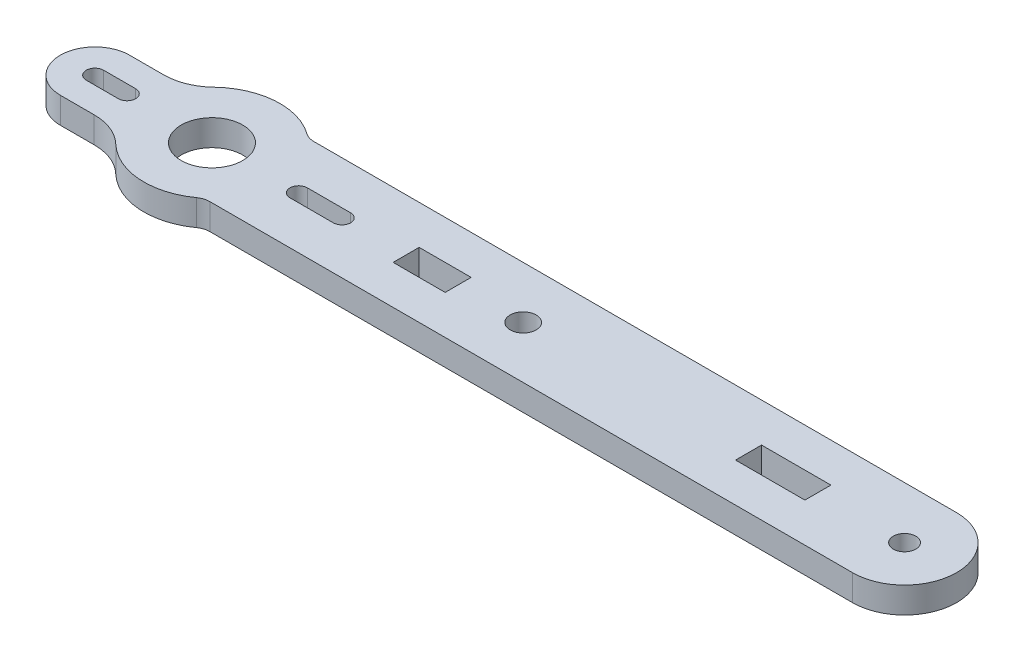
ISO-10303-21;
HEADER;
FILE_DESCRIPTION(('STEP AP214'),'2;1');
FILE_NAME('part.step','',(''),(''),'','','');
FILE_SCHEMA(('AUTOMOTIVE_DESIGN { 1 0 10303 214 1 1 1 1 }'));
ENDSEC;
DATA;
#1=APPLICATION_CONTEXT('core data for automotive mechanical design processes');
#2=APPLICATION_PROTOCOL_DEFINITION('international standard','automotive_design',2000,#1);
#3=PRODUCT_CONTEXT('',#1,'mechanical');
#4=PRODUCT('Part','Part','',(#3));
#5=PRODUCT_RELATED_PRODUCT_CATEGORY('part','',(#4));
#6=PRODUCT_DEFINITION_FORMATION('','',#4);
#7=PRODUCT_DEFINITION_CONTEXT('part definition',#1,'design');
#8=PRODUCT_DEFINITION('design','',#6,#7);
#9=PRODUCT_DEFINITION_SHAPE('','',#8);
#10=(LENGTH_UNIT() NAMED_UNIT(*) SI_UNIT(.MILLI.,.METRE.));
#11=(NAMED_UNIT(*) PLANE_ANGLE_UNIT() SI_UNIT($,.RADIAN.));
#12=(NAMED_UNIT(*) SI_UNIT($,.STERADIAN.) SOLID_ANGLE_UNIT());
#13=UNCERTAINTY_MEASURE_WITH_UNIT(LENGTH_MEASURE(1.E-05),#10,'distance_accuracy_value','');
#14=(GEOMETRIC_REPRESENTATION_CONTEXT(3) GLOBAL_UNCERTAINTY_ASSIGNED_CONTEXT((#13)) GLOBAL_UNIT_ASSIGNED_CONTEXT((#10,
#11,#12)) REPRESENTATION_CONTEXT('',''));
#15=CARTESIAN_POINT('',(0.,0.,0.));
#16=DIRECTION('',(0.,0.,1.));
#17=DIRECTION('',(1.,0.,0.));
#18=AXIS2_PLACEMENT_3D('',#15,#16,#17);
#19=CARTESIAN_POINT('',(0.,-3.,0.));
#20=DIRECTION('',(0.,1.,0.));
#21=DIRECTION('',(0.,0.,1.));
#22=AXIS2_PLACEMENT_3D('',#19,#20,#21);
#23=CYLINDRICAL_SURFACE('',#22,4.);
#24=CARTESIAN_POINT('',(0.,0.,0.));
#25=DIRECTION('',(0.,1.,0.));
#26=DIRECTION('',(0.,0.,1.));
#27=AXIS2_PLACEMENT_3D('',#24,#25,#26);
#28=CIRCLE('',#27,4.);
#29=CARTESIAN_POINT('',(0.,0.,-4.));
#30=VERTEX_POINT('',#29);
#31=CARTESIAN_POINT('',(0.,0.,4.));
#32=VERTEX_POINT('',#31);
#33=EDGE_CURVE('E369',#30,#32,#28,.T.);
#34=ORIENTED_EDGE('',*,*,#33,.F.);
#35=DIRECTION('',(0.,1.,0.));
#36=VECTOR('',#35,1.);
#37=CARTESIAN_POINT('',(0.,-3.,-4.));
#38=LINE('',#37,#36);
#39=CARTESIAN_POINT('',(0.,-3.,-4.));
#40=VERTEX_POINT('',#39);
#41=EDGE_CURVE('E410',#40,#30,#38,.T.);
#42=ORIENTED_EDGE('',*,*,#41,.F.);
#43=CARTESIAN_POINT('',(0.,-3.,0.));
#44=DIRECTION('',(0.,1.,0.));
#45=DIRECTION('',(0.,0.,1.));
#46=AXIS2_PLACEMENT_3D('',#43,#44,#45);
#47=CIRCLE('',#46,4.);
#48=CARTESIAN_POINT('',(0.,-3.,4.));
#49=VERTEX_POINT('',#48);
#50=EDGE_CURVE('E370',#40,#49,#47,.T.);
#51=ORIENTED_EDGE('',*,*,#50,.T.);
#52=DIRECTION('',(0.,1.,0.));
#53=VECTOR('',#52,1.);
#54=CARTESIAN_POINT('',(0.,-3.,4.));
#55=LINE('',#54,#53);
#56=EDGE_CURVE('E391',#49,#32,#55,.T.);
#57=ORIENTED_EDGE('',*,*,#56,.T.);
#58=EDGE_LOOP('',(#34,#42,#51,#57));
#59=FACE_BOUND('',#58,.T.);
#60=ADVANCED_FACE('F36',(#59),#23,.T.);
#61=CARTESIAN_POINT('',(0.,-3.,-4.));
#62=DIRECTION('',(0.,0.,1.));
#63=DIRECTION('',(1.,0.,0.));
#64=AXIS2_PLACEMENT_3D('',#61,#62,#63);
#65=PLANE('',#64);
#66=DIRECTION('',(1.,0.,0.));
#67=VECTOR('',#66,1.);
#68=CARTESIAN_POINT('',(0.,0.,-4.));
#69=LINE('',#68,#67);
#70=CARTESIAN_POINT('',(3.91759424778935,0.,-4.));
#71=VERTEX_POINT('',#70);
#72=EDGE_CURVE('E374',#30,#71,#69,.T.);
#73=ORIENTED_EDGE('',*,*,#72,.T.);
#74=DIRECTION('',(0.,1.,0.));
#75=VECTOR('',#74,1.);
#76=CARTESIAN_POINT('',(3.91759424778935,-3.,-4.));
#77=LINE('',#76,#75);
#78=CARTESIAN_POINT('',(3.91759424778935,-3.,-4.));
#79=VERTEX_POINT('',#78);
#80=EDGE_CURVE('E51',#71,#79,#77,.F.);
#81=ORIENTED_EDGE('',*,*,#80,.T.);
#82=DIRECTION('',(1.,0.,0.));
#83=VECTOR('',#82,1.);
#84=CARTESIAN_POINT('',(0.,-3.,-4.));
#85=LINE('',#84,#83);
#86=EDGE_CURVE('E389',#40,#79,#85,.T.);
#87=ORIENTED_EDGE('',*,*,#86,.F.);
#88=ORIENTED_EDGE('',*,*,#41,.T.);
#89=EDGE_LOOP('',(#73,#81,#87,#88));
#90=FACE_BOUND('',#89,.T.);
#91=ADVANCED_FACE('F500',(#90),#65,.F.);
#92=CARTESIAN_POINT('',(13.5,-3.,0.));
#93=DIRECTION('',(0.,1.,0.));
#94=DIRECTION('',(0.,0.,1.));
#95=AXIS2_PLACEMENT_3D('',#92,#93,#94);
#96=CYLINDRICAL_SURFACE('',#95,7.84999999999999);
#97=CARTESIAN_POINT('',(13.5,-3.,0.));
#98=DIRECTION('',(0.,1.,0.));
#99=DIRECTION('',(0.,0.,1.));
#100=AXIS2_PLACEMENT_3D('',#97,#98,#99);
#101=CIRCLE('',#100,7.84999999999999);
#102=CARTESIAN_POINT('',(18.0797144557127,-3.,-6.3756345177665));
#103=VERTEX_POINT('',#102);
#104=CARTESIAN_POINT('',(8.06881695632826,-3.,-5.66787003610108));
#105=VERTEX_POINT('',#104);
#106=EDGE_CURVE('E380',#103,#105,#101,.T.);
#107=ORIENTED_EDGE('',*,*,#106,.T.);
#108=DIRECTION('',(0.,1.,0.));
#109=VECTOR('',#108,1.);
#110=CARTESIAN_POINT('',(8.06881695632826,-3.,-5.66787003610108));
#111=LINE('',#110,#109);
#112=CARTESIAN_POINT('',(8.06881695632826,0.,-5.66787003610108));
#113=VERTEX_POINT('',#112);
#114=EDGE_CURVE('E441',#105,#113,#111,.T.);
#115=ORIENTED_EDGE('',*,*,#114,.T.);
#116=CARTESIAN_POINT('',(13.5,0.,0.));
#117=DIRECTION('',(0.,1.,0.));
#118=DIRECTION('',(0.,0.,1.));
#119=AXIS2_PLACEMENT_3D('',#116,#117,#118);
#120=CIRCLE('',#119,7.84999999999999);
#121=CARTESIAN_POINT('',(18.0797144557127,0.,-6.3756345177665));
#122=VERTEX_POINT('',#121);
#123=EDGE_CURVE('E400',#122,#113,#120,.T.);
#124=ORIENTED_EDGE('',*,*,#123,.F.);
#125=DIRECTION('',(0.,1.,0.));
#126=VECTOR('',#125,1.);
#127=CARTESIAN_POINT('',(18.0797144557127,-3.,-6.3756345177665));
#128=LINE('',#127,#126);
#129=EDGE_CURVE('E425',#122,#103,#128,.F.);
#130=ORIENTED_EDGE('',*,*,#129,.T.);
#131=EDGE_LOOP('',(#107,#115,#124,#130));
#132=FACE_BOUND('',#131,.T.);
#133=ADVANCED_FACE('F491',(#132),#96,.T.);
#134=CARTESIAN_POINT('',(0.,-3.,-6.00000000000001));
#135=DIRECTION('',(0.,0.,-1.));
#136=DIRECTION('',(-1.,0.,0.));
#137=AXIS2_PLACEMENT_3D('',#134,#135,#136);
#138=PLANE('',#137);
#139=DIRECTION('',(-1.,0.,0.));
#140=VECTOR('',#139,1.);
#141=CARTESIAN_POINT('',(0.,-3.,-6.00000000000001));
#142=LINE('',#141,#140);
#143=CARTESIAN_POINT('',(93.4,-3.,-6.));
#144=VERTEX_POINT('',#143);
#145=CARTESIAN_POINT('',(19.2465206864676,-3.,-6.00000000000001));
#146=VERTEX_POINT('',#145);
#147=EDGE_CURVE('E386',#144,#146,#142,.T.);
#148=ORIENTED_EDGE('',*,*,#147,.T.);
#149=DIRECTION('',(0.,-1.,0.));
#150=VECTOR('',#149,1.);
#151=CARTESIAN_POINT('',(19.2465206864676,0.,-6.00000000000001));
#152=LINE('',#151,#150);
#153=CARTESIAN_POINT('',(19.2465206864676,0.,-6.00000000000001));
#154=VERTEX_POINT('',#153);
#155=EDGE_CURVE('E422',#146,#154,#152,.F.);
#156=ORIENTED_EDGE('',*,*,#155,.T.);
#157=DIRECTION('',(-1.,0.,0.));
#158=VECTOR('',#157,1.);
#159=CARTESIAN_POINT('',(0.,0.,-6.00000000000001));
#160=LINE('',#159,#158);
#161=CARTESIAN_POINT('',(93.4,0.,-6.));
#162=VERTEX_POINT('',#161);
#163=EDGE_CURVE('E406',#162,#154,#160,.T.);
#164=ORIENTED_EDGE('',*,*,#163,.F.);
#165=DIRECTION('',(0.,1.,0.));
#166=VECTOR('',#165,1.);
#167=CARTESIAN_POINT('',(93.4,-3.,-6.));
#168=LINE('',#167,#166);
#169=EDGE_CURVE('E413',#144,#162,#168,.T.);
#170=ORIENTED_EDGE('',*,*,#169,.F.);
#171=EDGE_LOOP('',(#148,#156,#164,#170));
#172=FACE_BOUND('',#171,.T.);
#173=ADVANCED_FACE('F481',(#172),#138,.T.);
#174=CARTESIAN_POINT('',(93.4,-3.,0.));
#175=DIRECTION('',(0.,1.,0.));
#176=DIRECTION('',(0.,0.,1.));
#177=AXIS2_PLACEMENT_3D('',#174,#175,#176);
#178=CYLINDRICAL_SURFACE('',#177,6.);
#179=CARTESIAN_POINT('',(93.4,0.,0.));
#180=DIRECTION('',(0.,1.,0.));
#181=DIRECTION('',(0.,0.,1.));
#182=AXIS2_PLACEMENT_3D('',#179,#180,#181);
#183=CIRCLE('',#182,6.);
#184=CARTESIAN_POINT('',(93.4,0.,6.));
#185=VERTEX_POINT('',#184);
#186=EDGE_CURVE('E403',#185,#162,#183,.T.);
#187=ORIENTED_EDGE('',*,*,#186,.F.);
#188=DIRECTION('',(0.,1.,0.));
#189=VECTOR('',#188,1.);
#190=CARTESIAN_POINT('',(93.4,-3.,6.));
#191=LINE('',#190,#189);
#192=CARTESIAN_POINT('',(93.4,-3.,6.));
#193=VERTEX_POINT('',#192);
#194=EDGE_CURVE('E415',#193,#185,#191,.T.);
#195=ORIENTED_EDGE('',*,*,#194,.F.);
#196=CARTESIAN_POINT('',(93.4,-3.,0.));
#197=DIRECTION('',(0.,1.,0.));
#198=DIRECTION('',(0.,0.,1.));
#199=AXIS2_PLACEMENT_3D('',#196,#197,#198);
#200=CIRCLE('',#199,6.);
#201=EDGE_CURVE('E383',#193,#144,#200,.T.);
#202=ORIENTED_EDGE('',*,*,#201,.T.);
#203=ORIENTED_EDGE('',*,*,#169,.T.);
#204=EDGE_LOOP('',(#187,#195,#202,#203));
#205=FACE_BOUND('',#204,.T.);
#206=ADVANCED_FACE('F477',(#205),#178,.T.);
#207=CARTESIAN_POINT('',(0.,-3.,6.00000000000001));
#208=DIRECTION('',(0.,0.,-1.));
#209=DIRECTION('',(-1.,0.,0.));
#210=AXIS2_PLACEMENT_3D('',#207,#208,#209);
#211=PLANE('',#210);
#212=DIRECTION('',(-1.,0.,0.));
#213=VECTOR('',#212,1.);
#214=CARTESIAN_POINT('',(0.,0.,6.00000000000001));
#215=LINE('',#214,#213);
#216=CARTESIAN_POINT('',(19.2465206864676,0.,6.00000000000001));
#217=VERTEX_POINT('',#216);
#218=EDGE_CURVE('E399',#185,#217,#215,.T.);
#219=ORIENTED_EDGE('',*,*,#218,.T.);
#220=DIRECTION('',(0.,1.,0.));
#221=VECTOR('',#220,1.);
#222=CARTESIAN_POINT('',(19.2465206864676,-3.,6.00000000000001));
#223=LINE('',#222,#221);
#224=CARTESIAN_POINT('',(19.2465206864676,-3.,6.00000000000001));
#225=VERTEX_POINT('',#224);
#226=EDGE_CURVE('E420',#217,#225,#223,.F.);
#227=ORIENTED_EDGE('',*,*,#226,.T.);
#228=DIRECTION('',(-1.,0.,0.));
#229=VECTOR('',#228,1.);
#230=CARTESIAN_POINT('',(0.,-3.,6.00000000000001));
#231=LINE('',#230,#229);
#232=EDGE_CURVE('E379',#193,#225,#231,.T.);
#233=ORIENTED_EDGE('',*,*,#232,.F.);
#234=ORIENTED_EDGE('',*,*,#194,.T.);
#235=EDGE_LOOP('',(#219,#227,#233,#234));
#236=FACE_BOUND('',#235,.T.);
#237=ADVANCED_FACE('F473',(#236),#211,.F.);
#238=CARTESIAN_POINT('',(8.06881695632826,0.,5.66787003610108));
#239=VERTEX_POINT('',#238);
#240=CARTESIAN_POINT('',(18.0797144557127,0.,6.3756345177665));
#241=VERTEX_POINT('',#240);
#242=EDGE_CURVE('E397',#239,#241,#120,.T.);
#243=ORIENTED_EDGE('',*,*,#242,.F.);
#244=DIRECTION('',(0.,1.,0.));
#245=VECTOR('',#244,1.);
#246=CARTESIAN_POINT('',(8.06881695632826,-3.,5.66787003610108));
#247=LINE('',#246,#245);
#248=CARTESIAN_POINT('',(8.06881695632826,-3.,5.66787003610108));
#249=VERTEX_POINT('',#248);
#250=EDGE_CURVE('E439',#239,#249,#247,.F.);
#251=ORIENTED_EDGE('',*,*,#250,.T.);
#252=CARTESIAN_POINT('',(18.0797144557127,-3.,6.3756345177665));
#253=VERTEX_POINT('',#252);
#254=EDGE_CURVE('E377',#249,#253,#101,.T.);
#255=ORIENTED_EDGE('',*,*,#254,.T.);
#256=DIRECTION('',(0.,1.,0.));
#257=VECTOR('',#256,1.);
#258=CARTESIAN_POINT('',(18.0797144557127,-3.,6.3756345177665));
#259=LINE('',#258,#257);
#260=EDGE_CURVE('E412',#253,#241,#259,.T.);
#261=ORIENTED_EDGE('',*,*,#260,.T.);
#262=EDGE_LOOP('',(#243,#251,#255,#261));
#263=FACE_BOUND('',#262,.T.);
#264=ADVANCED_FACE('F464',(#263),#96,.T.);
#265=CARTESIAN_POINT('',(0.,-3.,4.));
#266=DIRECTION('',(0.,0.,1.));
#267=DIRECTION('',(1.,0.,0.));
#268=AXIS2_PLACEMENT_3D('',#265,#266,#267);
#269=PLANE('',#268);
#270=DIRECTION('',(1.,0.,0.));
#271=VECTOR('',#270,1.);
#272=CARTESIAN_POINT('',(0.,-3.,4.));
#273=LINE('',#272,#271);
#274=CARTESIAN_POINT('',(3.91759424778935,-3.,4.));
#275=VERTEX_POINT('',#274);
#276=EDGE_CURVE('E373',#49,#275,#273,.T.);
#277=ORIENTED_EDGE('',*,*,#276,.T.);
#278=DIRECTION('',(0.,-1.,0.));
#279=VECTOR('',#278,1.);
#280=CARTESIAN_POINT('',(3.91759424778935,0.,4.));
#281=LINE('',#280,#279);
#282=CARTESIAN_POINT('',(3.91759424778935,0.,4.));
#283=VERTEX_POINT('',#282);
#284=EDGE_CURVE('E436',#275,#283,#281,.F.);
#285=ORIENTED_EDGE('',*,*,#284,.T.);
#286=DIRECTION('',(1.,0.,0.));
#287=VECTOR('',#286,1.);
#288=CARTESIAN_POINT('',(0.,0.,4.));
#289=LINE('',#288,#287);
#290=EDGE_CURVE('E394',#32,#283,#289,.T.);
#291=ORIENTED_EDGE('',*,*,#290,.F.);
#292=ORIENTED_EDGE('',*,*,#56,.F.);
#293=EDGE_LOOP('',(#277,#285,#291,#292));
#294=FACE_BOUND('',#293,.T.);
#295=ADVANCED_FACE('F457',(#294),#269,.T.);
#296=CARTESIAN_POINT('',(0.,-3.,0.));
#297=DIRECTION('',(0.,1.,0.));
#298=DIRECTION('',(0.,0.,1.));
#299=AXIS2_PLACEMENT_3D('',#296,#297,#298);
#300=PLANE('',#299);
#301=CARTESIAN_POINT('',(49.4,-3.,0.));
#302=DIRECTION('',(0.,1.,0.));
#303=DIRECTION('',(0.,0.,1.));
#304=AXIS2_PLACEMENT_3D('',#301,#302,#303);
#305=CIRCLE('',#304,1.5);
#306=CARTESIAN_POINT('',(49.4,-3.,1.50000000000001));
#307=VERTEX_POINT('',#306);
#308=EDGE_CURVE('E802',#307,#307,#305,.T.);
#309=ORIENTED_EDGE('',*,*,#308,.T.);
#310=EDGE_LOOP('',(#309));
#311=FACE_BOUND('',#310,.T.);
#312=CARTESIAN_POINT('',(93.4,-3.,0.));
#313=DIRECTION('',(0.,1.,0.));
#314=DIRECTION('',(0.,0.,1.));
#315=AXIS2_PLACEMENT_3D('',#312,#313,#314);
#316=CIRCLE('',#315,1.3);
#317=CARTESIAN_POINT('',(93.4,-3.,1.3));
#318=VERTEX_POINT('',#317);
#319=EDGE_CURVE('E252',#318,#318,#316,.T.);
#320=ORIENTED_EDGE('',*,*,#319,.T.);
#321=EDGE_LOOP('',(#320));
#322=FACE_BOUND('',#321,.T.);
#323=DIRECTION('',(1.,0.,0.));
#324=VECTOR('',#323,1.);
#325=CARTESIAN_POINT('',(75.4,-3.,1.5));
#326=LINE('',#325,#324);
#327=CARTESIAN_POINT('',(75.4,-3.,1.5));
#328=VERTEX_POINT('',#327);
#329=CARTESIAN_POINT('',(83.4,-3.,1.5));
#330=VERTEX_POINT('',#329);
#331=EDGE_CURVE('E233',#328,#330,#326,.T.);
#332=ORIENTED_EDGE('',*,*,#331,.T.);
#333=DIRECTION('',(0.,0.,-1.));
#334=VECTOR('',#333,1.);
#335=CARTESIAN_POINT('',(83.4,-3.,1.5));
#336=LINE('',#335,#334);
#337=CARTESIAN_POINT('',(83.4,-3.,-1.5));
#338=VERTEX_POINT('',#337);
#339=EDGE_CURVE('E225',#330,#338,#336,.T.);
#340=ORIENTED_EDGE('',*,*,#339,.T.);
#341=DIRECTION('',(-1.,0.,0.));
#342=VECTOR('',#341,1.);
#343=CARTESIAN_POINT('',(75.4,-3.,-1.5));
#344=LINE('',#343,#342);
#345=CARTESIAN_POINT('',(75.4,-3.,-1.5));
#346=VERTEX_POINT('',#345);
#347=EDGE_CURVE('E237',#338,#346,#344,.T.);
#348=ORIENTED_EDGE('',*,*,#347,.T.);
#349=DIRECTION('',(0.,0.,1.));
#350=VECTOR('',#349,1.);
#351=CARTESIAN_POINT('',(75.4,-3.,1.5));
#352=LINE('',#351,#350);
#353=EDGE_CURVE('E241',#346,#328,#352,.T.);
#354=ORIENTED_EDGE('',*,*,#353,.T.);
#355=EDGE_LOOP('',(#332,#340,#348,#354));
#356=FACE_BOUND('',#355,.T.);
#357=DIRECTION('',(1.,0.,0.));
#358=VECTOR('',#357,1.);
#359=CARTESIAN_POINT('',(35.9,-3.,1.5));
#360=LINE('',#359,#358);
#361=CARTESIAN_POINT('',(35.9,-3.,1.5));
#362=VERTEX_POINT('',#361);
#363=CARTESIAN_POINT('',(41.9,-3.,1.5));
#364=VERTEX_POINT('',#363);
#365=EDGE_CURVE('E279',#362,#364,#360,.T.);
#366=ORIENTED_EDGE('',*,*,#365,.T.);
#367=DIRECTION('',(0.,0.,-1.));
#368=VECTOR('',#367,1.);
#369=CARTESIAN_POINT('',(41.9,-3.,1.5));
#370=LINE('',#369,#368);
#371=CARTESIAN_POINT('',(41.9,-3.,-1.5));
#372=VERTEX_POINT('',#371);
#373=EDGE_CURVE('E269',#364,#372,#370,.T.);
#374=ORIENTED_EDGE('',*,*,#373,.T.);
#375=DIRECTION('',(-1.,0.,0.));
#376=VECTOR('',#375,1.);
#377=CARTESIAN_POINT('',(35.9,-3.,-1.5));
#378=LINE('',#377,#376);
#379=CARTESIAN_POINT('',(35.9,-3.,-1.5));
#380=VERTEX_POINT('',#379);
#381=EDGE_CURVE('E272',#372,#380,#378,.T.);
#382=ORIENTED_EDGE('',*,*,#381,.T.);
#383=DIRECTION('',(0.,0.,1.));
#384=VECTOR('',#383,1.);
#385=CARTESIAN_POINT('',(35.9,-3.,1.5));
#386=LINE('',#385,#384);
#387=EDGE_CURVE('E276',#380,#362,#386,.T.);
#388=ORIENTED_EDGE('',*,*,#387,.T.);
#389=EDGE_LOOP('',(#366,#374,#382,#388));
#390=FACE_BOUND('',#389,.T.);
#391=DIRECTION('',(-1.,0.,0.));
#392=VECTOR('',#391,1.);
#393=CARTESIAN_POINT('',(0.,-3.,-1.));
#394=LINE('',#393,#392);
#395=CARTESIAN_POINT('',(3.7,-3.,-1.));
#396=VERTEX_POINT('',#395);
#397=CARTESIAN_POINT('',(0.,-3.,-1.));
#398=VERTEX_POINT('',#397);
#399=EDGE_CURVE('E310',#396,#398,#394,.T.);
#400=ORIENTED_EDGE('',*,*,#399,.T.);
#401=CARTESIAN_POINT('',(0.,-3.,0.));
#402=DIRECTION('',(0.,1.,0.));
#403=DIRECTION('',(0.,0.,1.));
#404=AXIS2_PLACEMENT_3D('',#401,#402,#403);
#405=CIRCLE('',#404,1.);
#406=CARTESIAN_POINT('',(0.,-3.,1.));
#407=VERTEX_POINT('',#406);
#408=EDGE_CURVE('E300',#398,#407,#405,.T.);
#409=ORIENTED_EDGE('',*,*,#408,.T.);
#410=DIRECTION('',(1.,0.,0.));
#411=VECTOR('',#410,1.);
#412=CARTESIAN_POINT('',(0.,-3.,1.));
#413=LINE('',#412,#411);
#414=CARTESIAN_POINT('',(3.7,-3.,1.));
#415=VERTEX_POINT('',#414);
#416=EDGE_CURVE('E303',#407,#415,#413,.T.);
#417=ORIENTED_EDGE('',*,*,#416,.T.);
#418=CARTESIAN_POINT('',(3.7,-3.,0.));
#419=DIRECTION('',(0.,1.,0.));
#420=DIRECTION('',(0.,0.,1.));
#421=AXIS2_PLACEMENT_3D('',#418,#419,#420);
#422=CIRCLE('',#421,1.);
#423=EDGE_CURVE('E307',#415,#396,#422,.T.);
#424=ORIENTED_EDGE('',*,*,#423,.T.);
#425=EDGE_LOOP('',(#400,#409,#417,#424));
#426=FACE_BOUND('',#425,.T.);
#427=DIRECTION('',(-1.,0.,0.));
#428=VECTOR('',#427,1.);
#429=CARTESIAN_POINT('',(23.5,-3.,-1.));
#430=LINE('',#429,#428);
#431=CARTESIAN_POINT('',(28.5,-3.,-1.));
#432=VERTEX_POINT('',#431);
#433=CARTESIAN_POINT('',(23.5,-3.,-1.));
#434=VERTEX_POINT('',#433);
#435=EDGE_CURVE('E344',#432,#434,#430,.T.);
#436=ORIENTED_EDGE('',*,*,#435,.T.);
#437=CARTESIAN_POINT('',(23.5,-3.,0.));
#438=DIRECTION('',(0.,1.,0.));
#439=DIRECTION('',(0.,0.,1.));
#440=AXIS2_PLACEMENT_3D('',#437,#438,#439);
#441=CIRCLE('',#440,1.);
#442=CARTESIAN_POINT('',(23.5,-3.,1.));
#443=VERTEX_POINT('',#442);
#444=EDGE_CURVE('E334',#434,#443,#441,.T.);
#445=ORIENTED_EDGE('',*,*,#444,.T.);
#446=DIRECTION('',(1.,0.,0.));
#447=VECTOR('',#446,1.);
#448=CARTESIAN_POINT('',(23.5,-3.,1.));
#449=LINE('',#448,#447);
#450=CARTESIAN_POINT('',(28.5,-3.,1.));
#451=VERTEX_POINT('',#450);
#452=EDGE_CURVE('E337',#443,#451,#449,.T.);
#453=ORIENTED_EDGE('',*,*,#452,.T.);
#454=CARTESIAN_POINT('',(28.5,-3.,0.));
#455=DIRECTION('',(0.,1.,0.));
#456=DIRECTION('',(0.,0.,1.));
#457=AXIS2_PLACEMENT_3D('',#454,#455,#456);
#458=CIRCLE('',#457,1.);
#459=EDGE_CURVE('E341',#451,#432,#458,.T.);
#460=ORIENTED_EDGE('',*,*,#459,.T.);
#461=EDGE_LOOP('',(#436,#445,#453,#460));
#462=FACE_BOUND('',#461,.T.);
#463=CARTESIAN_POINT('',(13.5,-3.,0.));
#464=DIRECTION('',(0.,1.,0.));
#465=DIRECTION('',(0.,0.,1.));
#466=AXIS2_PLACEMENT_3D('',#463,#464,#465);
#467=CIRCLE('',#466,3.55);
#468=CARTESIAN_POINT('',(13.5,-3.,3.55));
#469=VERTEX_POINT('',#468);
#470=EDGE_CURVE('E366',#469,#469,#467,.T.);
#471=ORIENTED_EDGE('',*,*,#470,.T.);
#472=EDGE_LOOP('',(#471));
#473=FACE_BOUND('',#472,.T.);
#474=ORIENTED_EDGE('',*,*,#50,.F.);
#475=ORIENTED_EDGE('',*,*,#86,.T.);
#476=CARTESIAN_POINT('',(3.91759424778935,-3.,-10.));
#477=DIRECTION('',(0.,1.,0.));
#478=DIRECTION('',(0.,0.,1.));
#479=AXIS2_PLACEMENT_3D('',#476,#477,#478);
#480=CIRCLE('',#479,6.);
#481=EDGE_CURVE('E11',#79,#105,#480,.T.);
#482=ORIENTED_EDGE('',*,*,#481,.T.);
#483=ORIENTED_EDGE('',*,*,#106,.F.);
#484=CARTESIAN_POINT('',(19.2465206864676,-3.,-8.00000000000001));
#485=DIRECTION('',(0.,1.,0.));
#486=DIRECTION('',(0.,0.,1.));
#487=AXIS2_PLACEMENT_3D('',#484,#485,#486);
#488=CIRCLE('',#487,2.);
#489=EDGE_CURVE('E434',#103,#146,#488,.T.);
#490=ORIENTED_EDGE('',*,*,#489,.T.);
#491=ORIENTED_EDGE('',*,*,#147,.F.);
#492=ORIENTED_EDGE('',*,*,#201,.F.);
#493=ORIENTED_EDGE('',*,*,#232,.T.);
#494=CARTESIAN_POINT('',(19.2465206864676,-3.,8.00000000000001));
#495=DIRECTION('',(0.,1.,0.));
#496=DIRECTION('',(0.,0.,1.));
#497=AXIS2_PLACEMENT_3D('',#494,#495,#496);
#498=CIRCLE('',#497,2.);
#499=EDGE_CURVE('E429',#225,#253,#498,.T.);
#500=ORIENTED_EDGE('',*,*,#499,.T.);
#501=ORIENTED_EDGE('',*,*,#254,.F.);
#502=CARTESIAN_POINT('',(3.91759424778935,-3.,10.));
#503=DIRECTION('',(0.,1.,0.));
#504=DIRECTION('',(0.,0.,1.));
#505=AXIS2_PLACEMENT_3D('',#502,#503,#504);
#506=CIRCLE('',#505,6.);
#507=EDGE_CURVE('E447',#249,#275,#506,.T.);
#508=ORIENTED_EDGE('',*,*,#507,.T.);
#509=ORIENTED_EDGE('',*,*,#276,.F.);
#510=EDGE_LOOP('',(#474,#475,#482,#483,#490,#491,#492,#493,#500,#501,#508,#509));
#511=FACE_BOUND('',#510,.T.);
#512=ADVANCED_FACE('F243',(#311,#322,#356,#390,#426,#462,#473,#511),#300,.F.);
#513=CARTESIAN_POINT('',(0.,0.,0.));
#514=DIRECTION('',(0.,1.,0.));
#515=DIRECTION('',(0.,0.,1.));
#516=AXIS2_PLACEMENT_3D('',#513,#514,#515);
#517=PLANE('',#516);
#518=CARTESIAN_POINT('',(49.4,0.,0.));
#519=DIRECTION('',(0.,1.,0.));
#520=DIRECTION('',(0.,0.,1.));
#521=AXIS2_PLACEMENT_3D('',#518,#519,#520);
#522=CIRCLE('',#521,1.5);
#523=CARTESIAN_POINT('',(49.4,0.,1.50000000000001));
#524=VERTEX_POINT('',#523);
#525=EDGE_CURVE('E805',#524,#524,#522,.T.);
#526=ORIENTED_EDGE('',*,*,#525,.F.);
#527=EDGE_LOOP('',(#526));
#528=FACE_BOUND('',#527,.T.);
#529=CARTESIAN_POINT('',(93.4,0.,0.));
#530=DIRECTION('',(0.,1.,0.));
#531=DIRECTION('',(0.,0.,1.));
#532=AXIS2_PLACEMENT_3D('',#529,#530,#531);
#533=CIRCLE('',#532,1.3);
#534=CARTESIAN_POINT('',(93.4,0.,1.3));
#535=VERTEX_POINT('',#534);
#536=EDGE_CURVE('E807',#535,#535,#533,.T.);
#537=ORIENTED_EDGE('',*,*,#536,.F.);
#538=EDGE_LOOP('',(#537));
#539=FACE_BOUND('',#538,.T.);
#540=DIRECTION('',(0.,0.,-1.));
#541=VECTOR('',#540,1.);
#542=CARTESIAN_POINT('',(83.4,0.,1.5));
#543=LINE('',#542,#541);
#544=CARTESIAN_POINT('',(83.4,0.,1.5));
#545=VERTEX_POINT('',#544);
#546=CARTESIAN_POINT('',(83.4,0.,-1.5));
#547=VERTEX_POINT('',#546);
#548=EDGE_CURVE('E228',#545,#547,#543,.T.);
#549=ORIENTED_EDGE('',*,*,#548,.F.);
#550=DIRECTION('',(1.,0.,0.));
#551=VECTOR('',#550,1.);
#552=CARTESIAN_POINT('',(75.4,0.,1.5));
#553=LINE('',#552,#551);
#554=CARTESIAN_POINT('',(75.4,0.,1.5));
#555=VERTEX_POINT('',#554);
#556=EDGE_CURVE('E246',#555,#545,#553,.T.);
#557=ORIENTED_EDGE('',*,*,#556,.F.);
#558=DIRECTION('',(0.,0.,1.));
#559=VECTOR('',#558,1.);
#560=CARTESIAN_POINT('',(75.4,0.,1.5));
#561=LINE('',#560,#559);
#562=CARTESIAN_POINT('',(75.4,0.,-1.5));
#563=VERTEX_POINT('',#562);
#564=EDGE_CURVE('E249',#563,#555,#561,.T.);
#565=ORIENTED_EDGE('',*,*,#564,.F.);
#566=DIRECTION('',(-1.,0.,0.));
#567=VECTOR('',#566,1.);
#568=CARTESIAN_POINT('',(75.4,0.,-1.5));
#569=LINE('',#568,#567);
#570=EDGE_CURVE('E258',#547,#563,#569,.T.);
#571=ORIENTED_EDGE('',*,*,#570,.F.);
#572=EDGE_LOOP('',(#549,#557,#565,#571));
#573=FACE_BOUND('',#572,.T.);
#574=DIRECTION('',(0.,0.,-1.));
#575=VECTOR('',#574,1.);
#576=CARTESIAN_POINT('',(41.9,0.,1.5));
#577=LINE('',#576,#575);
#578=CARTESIAN_POINT('',(41.9,0.,1.5));
#579=VERTEX_POINT('',#578);
#580=CARTESIAN_POINT('',(41.9,0.,-1.5));
#581=VERTEX_POINT('',#580);
#582=EDGE_CURVE('E283',#579,#581,#577,.T.);
#583=ORIENTED_EDGE('',*,*,#582,.F.);
#584=DIRECTION('',(1.,0.,0.));
#585=VECTOR('',#584,1.);
#586=CARTESIAN_POINT('',(35.9,0.,1.5));
#587=LINE('',#586,#585);
#588=CARTESIAN_POINT('',(35.9,0.,1.5));
#589=VERTEX_POINT('',#588);
#590=EDGE_CURVE('E273',#589,#579,#587,.T.);
#591=ORIENTED_EDGE('',*,*,#590,.F.);
#592=DIRECTION('',(0.,0.,1.));
#593=VECTOR('',#592,1.);
#594=CARTESIAN_POINT('',(35.9,0.,1.5));
#595=LINE('',#594,#593);
#596=CARTESIAN_POINT('',(35.9,0.,-1.5));
#597=VERTEX_POINT('',#596);
#598=EDGE_CURVE('E288',#597,#589,#595,.T.);
#599=ORIENTED_EDGE('',*,*,#598,.F.);
#600=DIRECTION('',(-1.,0.,0.));
#601=VECTOR('',#600,1.);
#602=CARTESIAN_POINT('',(35.9,0.,-1.5));
#603=LINE('',#602,#601);
#604=EDGE_CURVE('E285',#581,#597,#603,.T.);
#605=ORIENTED_EDGE('',*,*,#604,.F.);
#606=EDGE_LOOP('',(#583,#591,#599,#605));
#607=FACE_BOUND('',#606,.T.);
#608=CARTESIAN_POINT('',(0.,0.,0.));
#609=DIRECTION('',(0.,1.,0.));
#610=DIRECTION('',(0.,0.,1.));
#611=AXIS2_PLACEMENT_3D('',#608,#609,#610);
#612=CIRCLE('',#611,1.);
#613=CARTESIAN_POINT('',(0.,0.,-1.));
#614=VERTEX_POINT('',#613);
#615=CARTESIAN_POINT('',(0.,0.,1.));
#616=VERTEX_POINT('',#615);
#617=EDGE_CURVE('E314',#614,#616,#612,.T.);
#618=ORIENTED_EDGE('',*,*,#617,.F.);
#619=DIRECTION('',(-1.,0.,0.));
#620=VECTOR('',#619,1.);
#621=CARTESIAN_POINT('',(0.,0.,-1.));
#622=LINE('',#621,#620);
#623=CARTESIAN_POINT('',(3.7,0.,-1.));
#624=VERTEX_POINT('',#623);
#625=EDGE_CURVE('E304',#624,#614,#622,.T.);
#626=ORIENTED_EDGE('',*,*,#625,.F.);
#627=CARTESIAN_POINT('',(3.7,0.,0.));
#628=DIRECTION('',(0.,1.,0.));
#629=DIRECTION('',(0.,0.,1.));
#630=AXIS2_PLACEMENT_3D('',#627,#628,#629);
#631=CIRCLE('',#630,1.);
#632=CARTESIAN_POINT('',(3.7,0.,1.));
#633=VERTEX_POINT('',#632);
#634=EDGE_CURVE('E320',#633,#624,#631,.T.);
#635=ORIENTED_EDGE('',*,*,#634,.F.);
#636=DIRECTION('',(1.,0.,0.));
#637=VECTOR('',#636,1.);
#638=CARTESIAN_POINT('',(0.,0.,1.));
#639=LINE('',#638,#637);
#640=EDGE_CURVE('E316',#616,#633,#639,.T.);
#641=ORIENTED_EDGE('',*,*,#640,.F.);
#642=EDGE_LOOP('',(#618,#626,#635,#641));
#643=FACE_BOUND('',#642,.T.);
#644=CARTESIAN_POINT('',(23.5,0.,0.));
#645=DIRECTION('',(0.,1.,0.));
#646=DIRECTION('',(0.,0.,1.));
#647=AXIS2_PLACEMENT_3D('',#644,#645,#646);
#648=CIRCLE('',#647,1.);
#649=CARTESIAN_POINT('',(23.5,0.,-1.));
#650=VERTEX_POINT('',#649);
#651=CARTESIAN_POINT('',(23.5,0.,1.));
#652=VERTEX_POINT('',#651);
#653=EDGE_CURVE('E265',#650,#652,#648,.T.);
#654=ORIENTED_EDGE('',*,*,#653,.F.);
#655=DIRECTION('',(-1.,0.,0.));
#656=VECTOR('',#655,1.);
#657=CARTESIAN_POINT('',(23.5,0.,-1.));
#658=LINE('',#657,#656);
#659=CARTESIAN_POINT('',(28.5,0.,-1.));
#660=VERTEX_POINT('',#659);
#661=EDGE_CURVE('E338',#660,#650,#658,.T.);
#662=ORIENTED_EDGE('',*,*,#661,.F.);
#663=CARTESIAN_POINT('',(28.5,0.,0.));
#664=DIRECTION('',(0.,1.,0.));
#665=DIRECTION('',(0.,0.,1.));
#666=AXIS2_PLACEMENT_3D('',#663,#664,#665);
#667=CIRCLE('',#666,1.);
#668=CARTESIAN_POINT('',(28.5,0.,1.));
#669=VERTEX_POINT('',#668);
#670=EDGE_CURVE('E352',#669,#660,#667,.T.);
#671=ORIENTED_EDGE('',*,*,#670,.F.);
#672=DIRECTION('',(1.,0.,0.));
#673=VECTOR('',#672,1.);
#674=CARTESIAN_POINT('',(23.5,0.,1.));
#675=LINE('',#674,#673);
#676=EDGE_CURVE('E349',#652,#669,#675,.T.);
#677=ORIENTED_EDGE('',*,*,#676,.F.);
#678=EDGE_LOOP('',(#654,#662,#671,#677));
#679=FACE_BOUND('',#678,.T.);
#680=CARTESIAN_POINT('',(13.5,0.,0.));
#681=DIRECTION('',(0.,1.,0.));
#682=DIRECTION('',(0.,0.,1.));
#683=AXIS2_PLACEMENT_3D('',#680,#681,#682);
#684=CIRCLE('',#683,3.55);
#685=CARTESIAN_POINT('',(13.5,0.,3.55));
#686=VERTEX_POINT('',#685);
#687=EDGE_CURVE('E327',#686,#686,#684,.T.);
#688=ORIENTED_EDGE('',*,*,#687,.F.);
#689=EDGE_LOOP('',(#688));
#690=FACE_BOUND('',#689,.T.);
#691=ORIENTED_EDGE('',*,*,#33,.T.);
#692=ORIENTED_EDGE('',*,*,#290,.T.);
#693=CARTESIAN_POINT('',(3.91759424778935,0.,10.));
#694=DIRECTION('',(0.,1.,0.));
#695=DIRECTION('',(0.,0.,1.));
#696=AXIS2_PLACEMENT_3D('',#693,#694,#695);
#697=CIRCLE('',#696,6.);
#698=EDGE_CURVE('E445',#283,#239,#697,.F.);
#699=ORIENTED_EDGE('',*,*,#698,.T.);
#700=ORIENTED_EDGE('',*,*,#242,.T.);
#701=CARTESIAN_POINT('',(19.2465206864676,0.,8.00000000000001));
#702=DIRECTION('',(0.,1.,0.));
#703=DIRECTION('',(0.,0.,1.));
#704=AXIS2_PLACEMENT_3D('',#701,#702,#703);
#705=CIRCLE('',#704,2.);
#706=EDGE_CURVE('E427',#241,#217,#705,.F.);
#707=ORIENTED_EDGE('',*,*,#706,.T.);
#708=ORIENTED_EDGE('',*,*,#218,.F.);
#709=ORIENTED_EDGE('',*,*,#186,.T.);
#710=ORIENTED_EDGE('',*,*,#163,.T.);
#711=CARTESIAN_POINT('',(19.2465206864676,0.,-8.00000000000001));
#712=DIRECTION('',(0.,1.,0.));
#713=DIRECTION('',(0.,0.,1.));
#714=AXIS2_PLACEMENT_3D('',#711,#712,#713);
#715=CIRCLE('',#714,2.);
#716=EDGE_CURVE('E432',#154,#122,#715,.F.);
#717=ORIENTED_EDGE('',*,*,#716,.T.);
#718=ORIENTED_EDGE('',*,*,#123,.T.);
#719=CARTESIAN_POINT('',(3.91759424778935,0.,-10.));
#720=DIRECTION('',(0.,1.,0.));
#721=DIRECTION('',(0.,0.,1.));
#722=AXIS2_PLACEMENT_3D('',#719,#720,#721);
#723=CIRCLE('',#722,6.);
#724=EDGE_CURVE('E44',#113,#71,#723,.F.);
#725=ORIENTED_EDGE('',*,*,#724,.T.);
#726=ORIENTED_EDGE('',*,*,#72,.F.);
#727=EDGE_LOOP('',(#691,#692,#699,#700,#707,#708,#709,#710,#717,#718,#725,#726));
#728=FACE_BOUND('',#727,.T.);
#729=ADVANCED_FACE('F461',(#528,#539,#573,#607,#643,#679,#690,#728),#517,.T.);
#730=CARTESIAN_POINT('',(13.5,0.,0.));
#731=DIRECTION('',(0.,1.,0.));
#732=DIRECTION('',(0.,0.,1.));
#733=AXIS2_PLACEMENT_3D('',#730,#731,#732);
#734=CYLINDRICAL_SURFACE('',#733,3.55);
#735=ORIENTED_EDGE('',*,*,#470,.F.);
#736=EDGE_LOOP('',(#735));
#737=FACE_BOUND('',#736,.T.);
#738=ORIENTED_EDGE('',*,*,#687,.T.);
#739=EDGE_LOOP('',(#738));
#740=FACE_BOUND('',#739,.T.);
#741=ADVANCED_FACE('F538',(#737,#740),#734,.F.);
#742=CARTESIAN_POINT('',(23.5,-3.,0.));
#743=DIRECTION('',(0.,1.,0.));
#744=DIRECTION('',(0.,0.,1.));
#745=AXIS2_PLACEMENT_3D('',#742,#743,#744);
#746=CYLINDRICAL_SURFACE('',#745,1.);
#747=ORIENTED_EDGE('',*,*,#653,.T.);
#748=DIRECTION('',(0.,1.,0.));
#749=VECTOR('',#748,1.);
#750=CARTESIAN_POINT('',(23.5,-3.,1.));
#751=LINE('',#750,#749);
#752=EDGE_CURVE('E347',#443,#652,#751,.T.);
#753=ORIENTED_EDGE('',*,*,#752,.F.);
#754=ORIENTED_EDGE('',*,*,#444,.F.);
#755=DIRECTION('',(0.,1.,0.));
#756=VECTOR('',#755,1.);
#757=CARTESIAN_POINT('',(23.5,-3.,-1.));
#758=LINE('',#757,#756);
#759=EDGE_CURVE('E317',#434,#650,#758,.T.);
#760=ORIENTED_EDGE('',*,*,#759,.T.);
#761=EDGE_LOOP('',(#747,#753,#754,#760));
#762=FACE_BOUND('',#761,.T.);
#763=ADVANCED_FACE('F604',(#762),#746,.F.);
#764=CARTESIAN_POINT('',(23.5,-3.,-1.));
#765=DIRECTION('',(0.,0.,-1.));
#766=DIRECTION('',(-1.,0.,0.));
#767=AXIS2_PLACEMENT_3D('',#764,#765,#766);
#768=PLANE('',#767);
#769=ORIENTED_EDGE('',*,*,#661,.T.);
#770=ORIENTED_EDGE('',*,*,#759,.F.);
#771=ORIENTED_EDGE('',*,*,#435,.F.);
#772=DIRECTION('',(0.,1.,0.));
#773=VECTOR('',#772,1.);
#774=CARTESIAN_POINT('',(28.5,-3.,-1.));
#775=LINE('',#774,#773);
#776=EDGE_CURVE('E358',#432,#660,#775,.T.);
#777=ORIENTED_EDGE('',*,*,#776,.T.);
#778=EDGE_LOOP('',(#769,#770,#771,#777));
#779=FACE_BOUND('',#778,.T.);
#780=ADVANCED_FACE('F614',(#779),#768,.F.);
#781=CARTESIAN_POINT('',(28.5,-3.,0.));
#782=DIRECTION('',(0.,1.,0.));
#783=DIRECTION('',(0.,0.,1.));
#784=AXIS2_PLACEMENT_3D('',#781,#782,#783);
#785=CYLINDRICAL_SURFACE('',#784,1.);
#786=ORIENTED_EDGE('',*,*,#670,.T.);
#787=ORIENTED_EDGE('',*,*,#776,.F.);
#788=ORIENTED_EDGE('',*,*,#459,.F.);
#789=DIRECTION('',(0.,1.,0.));
#790=VECTOR('',#789,1.);
#791=CARTESIAN_POINT('',(28.5,-3.,1.));
#792=LINE('',#791,#790);
#793=EDGE_CURVE('E360',#451,#669,#792,.T.);
#794=ORIENTED_EDGE('',*,*,#793,.T.);
#795=EDGE_LOOP('',(#786,#787,#788,#794));
#796=FACE_BOUND('',#795,.T.);
#797=ADVANCED_FACE('F624',(#796),#785,.F.);
#798=CARTESIAN_POINT('',(23.5,-3.,1.));
#799=DIRECTION('',(0.,0.,1.));
#800=DIRECTION('',(1.,0.,0.));
#801=AXIS2_PLACEMENT_3D('',#798,#799,#800);
#802=PLANE('',#801);
#803=ORIENTED_EDGE('',*,*,#676,.T.);
#804=ORIENTED_EDGE('',*,*,#793,.F.);
#805=ORIENTED_EDGE('',*,*,#452,.F.);
#806=ORIENTED_EDGE('',*,*,#752,.T.);
#807=EDGE_LOOP('',(#803,#804,#805,#806));
#808=FACE_BOUND('',#807,.T.);
#809=ADVANCED_FACE('F634',(#808),#802,.F.);
#810=CARTESIAN_POINT('',(0.,-3.,0.));
#811=DIRECTION('',(0.,1.,0.));
#812=DIRECTION('',(0.,0.,1.));
#813=AXIS2_PLACEMENT_3D('',#810,#811,#812);
#814=CYLINDRICAL_SURFACE('',#813,1.);
#815=ORIENTED_EDGE('',*,*,#617,.T.);
#816=DIRECTION('',(0.,1.,0.));
#817=VECTOR('',#816,1.);
#818=CARTESIAN_POINT('',(0.,-3.,1.));
#819=LINE('',#818,#817);
#820=EDGE_CURVE('E313',#407,#616,#819,.T.);
#821=ORIENTED_EDGE('',*,*,#820,.F.);
#822=ORIENTED_EDGE('',*,*,#408,.F.);
#823=DIRECTION('',(0.,1.,0.));
#824=VECTOR('',#823,1.);
#825=CARTESIAN_POINT('',(0.,-3.,-1.));
#826=LINE('',#825,#824);
#827=EDGE_CURVE('E325',#398,#614,#826,.T.);
#828=ORIENTED_EDGE('',*,*,#827,.T.);
#829=EDGE_LOOP('',(#815,#821,#822,#828));
#830=FACE_BOUND('',#829,.T.);
#831=ADVANCED_FACE('F644',(#830),#814,.F.);
#832=CARTESIAN_POINT('',(0.,-3.,-1.));
#833=DIRECTION('',(0.,0.,-1.));
#834=DIRECTION('',(-1.,0.,0.));
#835=AXIS2_PLACEMENT_3D('',#832,#833,#834);
#836=PLANE('',#835);
#837=ORIENTED_EDGE('',*,*,#625,.T.);
#838=ORIENTED_EDGE('',*,*,#827,.F.);
#839=ORIENTED_EDGE('',*,*,#399,.F.);
#840=DIRECTION('',(0.,1.,0.));
#841=VECTOR('',#840,1.);
#842=CARTESIAN_POINT('',(3.7,-3.,-1.));
#843=LINE('',#842,#841);
#844=EDGE_CURVE('E328',#396,#624,#843,.T.);
#845=ORIENTED_EDGE('',*,*,#844,.T.);
#846=EDGE_LOOP('',(#837,#838,#839,#845));
#847=FACE_BOUND('',#846,.T.);
#848=ADVANCED_FACE('F654',(#847),#836,.F.);
#849=CARTESIAN_POINT('',(3.7,-3.,0.));
#850=DIRECTION('',(0.,1.,0.));
#851=DIRECTION('',(0.,0.,1.));
#852=AXIS2_PLACEMENT_3D('',#849,#850,#851);
#853=CYLINDRICAL_SURFACE('',#852,1.);
#854=ORIENTED_EDGE('',*,*,#634,.T.);
#855=ORIENTED_EDGE('',*,*,#844,.F.);
#856=ORIENTED_EDGE('',*,*,#423,.F.);
#857=DIRECTION('',(0.,1.,0.));
#858=VECTOR('',#857,1.);
#859=CARTESIAN_POINT('',(3.7,-3.,1.));
#860=LINE('',#859,#858);
#861=EDGE_CURVE('E330',#415,#633,#860,.T.);
#862=ORIENTED_EDGE('',*,*,#861,.T.);
#863=EDGE_LOOP('',(#854,#855,#856,#862));
#864=FACE_BOUND('',#863,.T.);
#865=ADVANCED_FACE('F664',(#864),#853,.F.);
#866=CARTESIAN_POINT('',(0.,-3.,1.));
#867=DIRECTION('',(0.,0.,1.));
#868=DIRECTION('',(1.,0.,0.));
#869=AXIS2_PLACEMENT_3D('',#866,#867,#868);
#870=PLANE('',#869);
#871=ORIENTED_EDGE('',*,*,#640,.T.);
#872=ORIENTED_EDGE('',*,*,#861,.F.);
#873=ORIENTED_EDGE('',*,*,#416,.F.);
#874=ORIENTED_EDGE('',*,*,#820,.T.);
#875=EDGE_LOOP('',(#871,#872,#873,#874));
#876=FACE_BOUND('',#875,.T.);
#877=ADVANCED_FACE('F674',(#876),#870,.F.);
#878=CARTESIAN_POINT('',(41.9,-3.,1.5));
#879=DIRECTION('',(1.,0.,0.));
#880=DIRECTION('',(0.,0.,-1.));
#881=AXIS2_PLACEMENT_3D('',#878,#879,#880);
#882=PLANE('',#881);
#883=ORIENTED_EDGE('',*,*,#582,.T.);
#884=DIRECTION('',(0.,1.,0.));
#885=VECTOR('',#884,1.);
#886=CARTESIAN_POINT('',(41.9,-3.,-1.5));
#887=LINE('',#886,#885);
#888=EDGE_CURVE('E282',#372,#581,#887,.T.);
#889=ORIENTED_EDGE('',*,*,#888,.F.);
#890=ORIENTED_EDGE('',*,*,#373,.F.);
#891=DIRECTION('',(0.,1.,0.));
#892=VECTOR('',#891,1.);
#893=CARTESIAN_POINT('',(41.9,-3.,1.5));
#894=LINE('',#893,#892);
#895=EDGE_CURVE('E259',#364,#579,#894,.T.);
#896=ORIENTED_EDGE('',*,*,#895,.T.);
#897=EDGE_LOOP('',(#883,#889,#890,#896));
#898=FACE_BOUND('',#897,.T.);
#899=ADVANCED_FACE('F684',(#898),#882,.F.);
#900=CARTESIAN_POINT('',(35.9,-3.,1.5));
#901=DIRECTION('',(0.,0.,1.));
#902=DIRECTION('',(1.,0.,0.));
#903=AXIS2_PLACEMENT_3D('',#900,#901,#902);
#904=PLANE('',#903);
#905=ORIENTED_EDGE('',*,*,#590,.T.);
#906=ORIENTED_EDGE('',*,*,#895,.F.);
#907=ORIENTED_EDGE('',*,*,#365,.F.);
#908=DIRECTION('',(0.,1.,0.));
#909=VECTOR('',#908,1.);
#910=CARTESIAN_POINT('',(35.9,-3.,1.5));
#911=LINE('',#910,#909);
#912=EDGE_CURVE('E294',#362,#589,#911,.T.);
#913=ORIENTED_EDGE('',*,*,#912,.T.);
#914=EDGE_LOOP('',(#905,#906,#907,#913));
#915=FACE_BOUND('',#914,.T.);
#916=ADVANCED_FACE('F694',(#915),#904,.F.);
#917=CARTESIAN_POINT('',(35.9,-3.,1.5));
#918=DIRECTION('',(-1.,0.,0.));
#919=DIRECTION('',(0.,0.,1.));
#920=AXIS2_PLACEMENT_3D('',#917,#918,#919);
#921=PLANE('',#920);
#922=ORIENTED_EDGE('',*,*,#598,.T.);
#923=ORIENTED_EDGE('',*,*,#912,.F.);
#924=ORIENTED_EDGE('',*,*,#387,.F.);
#925=DIRECTION('',(0.,1.,0.));
#926=VECTOR('',#925,1.);
#927=CARTESIAN_POINT('',(35.9,-3.,-1.5));
#928=LINE('',#927,#926);
#929=EDGE_CURVE('E296',#380,#597,#928,.T.);
#930=ORIENTED_EDGE('',*,*,#929,.T.);
#931=EDGE_LOOP('',(#922,#923,#924,#930));
#932=FACE_BOUND('',#931,.T.);
#933=ADVANCED_FACE('F704',(#932),#921,.F.);
#934=CARTESIAN_POINT('',(35.9,-3.,-1.5));
#935=DIRECTION('',(0.,0.,-1.));
#936=DIRECTION('',(-1.,0.,0.));
#937=AXIS2_PLACEMENT_3D('',#934,#935,#936);
#938=PLANE('',#937);
#939=ORIENTED_EDGE('',*,*,#604,.T.);
#940=ORIENTED_EDGE('',*,*,#929,.F.);
#941=ORIENTED_EDGE('',*,*,#381,.F.);
#942=ORIENTED_EDGE('',*,*,#888,.T.);
#943=EDGE_LOOP('',(#939,#940,#941,#942));
#944=FACE_BOUND('',#943,.T.);
#945=ADVANCED_FACE('F714',(#944),#938,.F.);
#946=CARTESIAN_POINT('',(83.4,-3.,1.5));
#947=DIRECTION('',(1.,0.,0.));
#948=DIRECTION('',(0.,0.,-1.));
#949=AXIS2_PLACEMENT_3D('',#946,#947,#948);
#950=PLANE('',#949);
#951=ORIENTED_EDGE('',*,*,#548,.T.);
#952=DIRECTION('',(0.,1.,0.));
#953=VECTOR('',#952,1.);
#954=CARTESIAN_POINT('',(83.4,-3.,-1.5));
#955=LINE('',#954,#953);
#956=EDGE_CURVE('E221',#338,#547,#955,.T.);
#957=ORIENTED_EDGE('',*,*,#956,.F.);
#958=ORIENTED_EDGE('',*,*,#339,.F.);
#959=DIRECTION('',(0.,1.,0.));
#960=VECTOR('',#959,1.);
#961=CARTESIAN_POINT('',(83.4,-3.,1.5));
#962=LINE('',#961,#960);
#963=EDGE_CURVE('E263',#330,#545,#962,.T.);
#964=ORIENTED_EDGE('',*,*,#963,.T.);
#965=EDGE_LOOP('',(#951,#957,#958,#964));
#966=FACE_BOUND('',#965,.T.);
#967=ADVANCED_FACE('F223',(#966),#950,.F.);
#968=CARTESIAN_POINT('',(75.4,-3.,1.5));
#969=DIRECTION('',(0.,0.,1.));
#970=DIRECTION('',(1.,0.,0.));
#971=AXIS2_PLACEMENT_3D('',#968,#969,#970);
#972=PLANE('',#971);
#973=ORIENTED_EDGE('',*,*,#556,.T.);
#974=ORIENTED_EDGE('',*,*,#963,.F.);
#975=ORIENTED_EDGE('',*,*,#331,.F.);
#976=DIRECTION('',(0.,1.,0.));
#977=VECTOR('',#976,1.);
#978=CARTESIAN_POINT('',(75.4,-3.,1.5));
#979=LINE('',#978,#977);
#980=EDGE_CURVE('E266',#328,#555,#979,.T.);
#981=ORIENTED_EDGE('',*,*,#980,.T.);
#982=EDGE_LOOP('',(#973,#974,#975,#981));
#983=FACE_BOUND('',#982,.T.);
#984=ADVANCED_FACE('F733',(#983),#972,.F.);
#985=CARTESIAN_POINT('',(75.4,-3.,1.5));
#986=DIRECTION('',(-1.,0.,0.));
#987=DIRECTION('',(0.,0.,1.));
#988=AXIS2_PLACEMENT_3D('',#985,#986,#987);
#989=PLANE('',#988);
#990=ORIENTED_EDGE('',*,*,#564,.T.);
#991=ORIENTED_EDGE('',*,*,#980,.F.);
#992=ORIENTED_EDGE('',*,*,#353,.F.);
#993=DIRECTION('',(0.,1.,0.));
#994=VECTOR('',#993,1.);
#995=CARTESIAN_POINT('',(75.4,-3.,-1.5));
#996=LINE('',#995,#994);
#997=EDGE_CURVE('E232',#346,#563,#996,.T.);
#998=ORIENTED_EDGE('',*,*,#997,.T.);
#999=EDGE_LOOP('',(#990,#991,#992,#998));
#1000=FACE_BOUND('',#999,.T.);
#1001=ADVANCED_FACE('F742',(#1000),#989,.F.);
#1002=CARTESIAN_POINT('',(75.4,-3.,-1.5));
#1003=DIRECTION('',(0.,0.,-1.));
#1004=DIRECTION('',(-1.,0.,0.));
#1005=AXIS2_PLACEMENT_3D('',#1002,#1003,#1004);
#1006=PLANE('',#1005);
#1007=ORIENTED_EDGE('',*,*,#570,.T.);
#1008=ORIENTED_EDGE('',*,*,#997,.F.);
#1009=ORIENTED_EDGE('',*,*,#347,.F.);
#1010=ORIENTED_EDGE('',*,*,#956,.T.);
#1011=EDGE_LOOP('',(#1007,#1008,#1009,#1010));
#1012=FACE_BOUND('',#1011,.T.);
#1013=ADVANCED_FACE('F238',(#1012),#1006,.F.);
#1014=CARTESIAN_POINT('',(93.4,0.,0.));
#1015=DIRECTION('',(0.,1.,0.));
#1016=DIRECTION('',(0.,0.,1.));
#1017=AXIS2_PLACEMENT_3D('',#1014,#1015,#1016);
#1018=CYLINDRICAL_SURFACE('',#1017,1.3);
#1019=ORIENTED_EDGE('',*,*,#319,.F.);
#1020=EDGE_LOOP('',(#1019));
#1021=FACE_BOUND('',#1020,.T.);
#1022=ORIENTED_EDGE('',*,*,#536,.T.);
#1023=EDGE_LOOP('',(#1022));
#1024=FACE_BOUND('',#1023,.T.);
#1025=ADVANCED_FACE('F761',(#1021,#1024),#1018,.F.);
#1026=CARTESIAN_POINT('',(49.4,0.,0.));
#1027=DIRECTION('',(0.,1.,0.));
#1028=DIRECTION('',(0.,0.,1.));
#1029=AXIS2_PLACEMENT_3D('',#1026,#1027,#1028);
#1030=CYLINDRICAL_SURFACE('',#1029,1.5);
#1031=ORIENTED_EDGE('',*,*,#308,.F.);
#1032=EDGE_LOOP('',(#1031));
#1033=FACE_BOUND('',#1032,.T.);
#1034=ORIENTED_EDGE('',*,*,#525,.T.);
#1035=EDGE_LOOP('',(#1034));
#1036=FACE_BOUND('',#1035,.T.);
#1037=ADVANCED_FACE('F513',(#1033,#1036),#1030,.F.);
#1038=CARTESIAN_POINT('',(19.2465206864676,-3.,8.00000000000001));
#1039=DIRECTION('',(0.,1.,0.));
#1040=DIRECTION('',(0.,0.,1.));
#1041=AXIS2_PLACEMENT_3D('',#1038,#1039,#1040);
#1042=CYLINDRICAL_SURFACE('',#1041,2.);
#1043=ORIENTED_EDGE('',*,*,#499,.F.);
#1044=ORIENTED_EDGE('',*,*,#226,.F.);
#1045=ORIENTED_EDGE('',*,*,#706,.F.);
#1046=ORIENTED_EDGE('',*,*,#260,.F.);
#1047=EDGE_LOOP('',(#1043,#1044,#1045,#1046));
#1048=FACE_BOUND('',#1047,.T.);
#1049=ADVANCED_FACE('F468',(#1048),#1042,.F.);
#1050=CARTESIAN_POINT('',(19.2465206864676,-3.,-8.00000000000001));
#1051=DIRECTION('',(0.,1.,0.));
#1052=DIRECTION('',(0.,0.,1.));
#1053=AXIS2_PLACEMENT_3D('',#1050,#1051,#1052);
#1054=CYLINDRICAL_SURFACE('',#1053,2.);
#1055=ORIENTED_EDGE('',*,*,#489,.F.);
#1056=ORIENTED_EDGE('',*,*,#129,.F.);
#1057=ORIENTED_EDGE('',*,*,#716,.F.);
#1058=ORIENTED_EDGE('',*,*,#155,.F.);
#1059=EDGE_LOOP('',(#1055,#1056,#1057,#1058));
#1060=FACE_BOUND('',#1059,.T.);
#1061=ADVANCED_FACE('F486',(#1060),#1054,.F.);
#1062=CARTESIAN_POINT('',(3.91759424778935,-3.,10.));
#1063=DIRECTION('',(0.,1.,0.));
#1064=DIRECTION('',(0.,0.,1.));
#1065=AXIS2_PLACEMENT_3D('',#1062,#1063,#1064);
#1066=CYLINDRICAL_SURFACE('',#1065,6.);
#1067=ORIENTED_EDGE('',*,*,#507,.F.);
#1068=ORIENTED_EDGE('',*,*,#250,.F.);
#1069=ORIENTED_EDGE('',*,*,#698,.F.);
#1070=ORIENTED_EDGE('',*,*,#284,.F.);
#1071=EDGE_LOOP('',(#1067,#1068,#1069,#1070));
#1072=FACE_BOUND('',#1071,.T.);
#1073=ADVANCED_FACE('F459',(#1072),#1066,.F.);
#1074=CARTESIAN_POINT('',(3.91759424778935,-3.,-10.));
#1075=DIRECTION('',(0.,1.,0.));
#1076=DIRECTION('',(0.,0.,1.));
#1077=AXIS2_PLACEMENT_3D('',#1074,#1075,#1076);
#1078=CYLINDRICAL_SURFACE('',#1077,6.);
#1079=ORIENTED_EDGE('',*,*,#481,.F.);
#1080=ORIENTED_EDGE('',*,*,#80,.F.);
#1081=ORIENTED_EDGE('',*,*,#724,.F.);
#1082=ORIENTED_EDGE('',*,*,#114,.F.);
#1083=EDGE_LOOP('',(#1079,#1080,#1081,#1082));
#1084=FACE_BOUND('',#1083,.T.);
#1085=ADVANCED_FACE('F38',(#1084),#1078,.F.);
#1086=CLOSED_SHELL('',(#60,#91,#133,#173,#206,#237,#264,#295,#512,#729,#741,#763,#780,#797,#809,
#831,#848,#865,#877,#899,#916,#933,#945,#967,#984,#1001,#1013,#1025,#1037,#1049,#1061,#1073,#1085));
#1087=MANIFOLD_SOLID_BREP('B2',#1086);
#1088=ADVANCED_BREP_SHAPE_REPRESENTATION('',(#18,#1087),#14);
#1089=SHAPE_DEFINITION_REPRESENTATION(#9,#1088);
ENDSEC;
END-ISO-10303-21;
